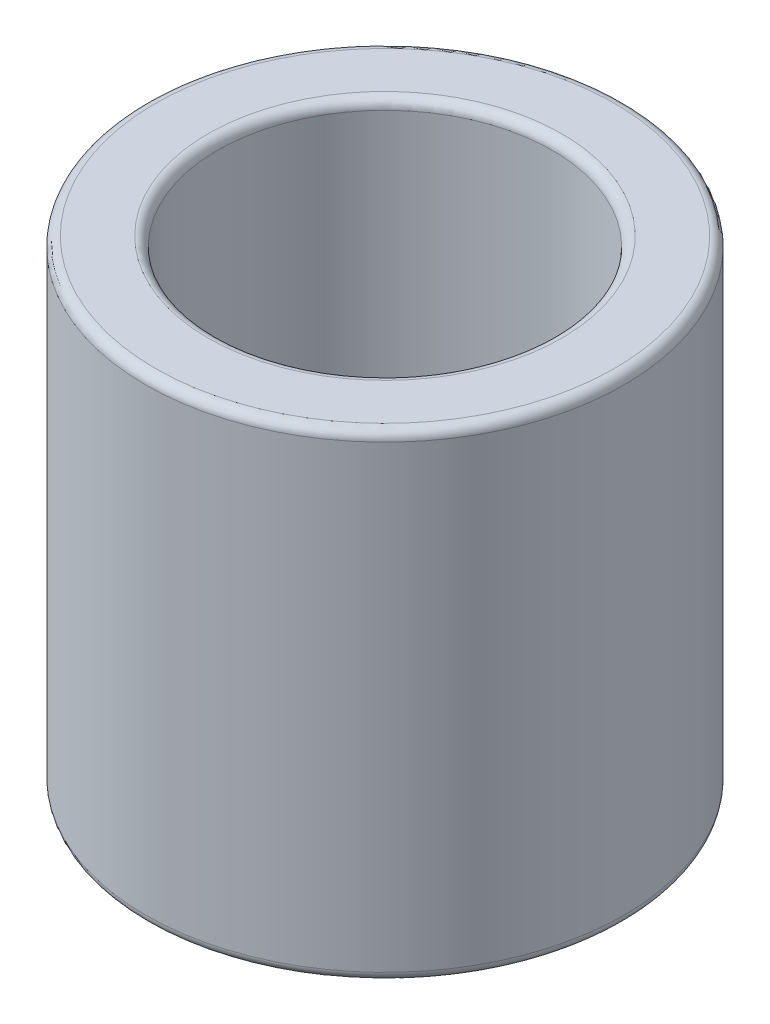
ISO-10303-21;
HEADER;
FILE_DESCRIPTION(('STEP AP214'),'2;1');
FILE_NAME('part.step','',(''),(''),'','','');
FILE_SCHEMA(('AUTOMOTIVE_DESIGN { 1 0 10303 214 1 1 1 1 }'));
ENDSEC;
DATA;
#1=APPLICATION_CONTEXT('core data for automotive mechanical design processes');
#2=APPLICATION_PROTOCOL_DEFINITION('international standard','automotive_design',2000,#1);
#3=PRODUCT_CONTEXT('',#1,'mechanical');
#4=PRODUCT('Part','Part','',(#3));
#5=PRODUCT_RELATED_PRODUCT_CATEGORY('part','',(#4));
#6=PRODUCT_DEFINITION_FORMATION('','',#4);
#7=PRODUCT_DEFINITION_CONTEXT('part definition',#1,'design');
#8=PRODUCT_DEFINITION('design','',#6,#7);
#9=PRODUCT_DEFINITION_SHAPE('','',#8);
#10=(LENGTH_UNIT() NAMED_UNIT(*) SI_UNIT(.MILLI.,.METRE.));
#11=(NAMED_UNIT(*) PLANE_ANGLE_UNIT() SI_UNIT($,.RADIAN.));
#12=(NAMED_UNIT(*) SI_UNIT($,.STERADIAN.) SOLID_ANGLE_UNIT());
#13=UNCERTAINTY_MEASURE_WITH_UNIT(LENGTH_MEASURE(1.E-05),#10,'distance_accuracy_value','');
#14=(GEOMETRIC_REPRESENTATION_CONTEXT(3) GLOBAL_UNCERTAINTY_ASSIGNED_CONTEXT((#13)) GLOBAL_UNIT_ASSIGNED_CONTEXT((#10,
#11,#12)) REPRESENTATION_CONTEXT('',''));
#15=CARTESIAN_POINT('',(0.,0.,0.));
#16=DIRECTION('',(0.,0.,1.));
#17=DIRECTION('',(1.,0.,0.));
#18=AXIS2_PLACEMENT_3D('',#15,#16,#17);
#19=CARTESIAN_POINT('',(0.,5.,0.));
#20=DIRECTION('',(0.,1.,0.));
#21=DIRECTION('',(0.,0.,1.));
#22=AXIS2_PLACEMENT_3D('',#19,#20,#21);
#23=PLANE('',#22);
#24=CARTESIAN_POINT('',(0.,5.,0.));
#25=DIRECTION('',(0.,1.,0.));
#26=DIRECTION('',(0.,0.,1.));
#27=AXIS2_PLACEMENT_3D('',#24,#25,#26);
#28=CIRCLE('',#27,1.85);
#29=CARTESIAN_POINT('',(0.,5.,1.85));
#30=VERTEX_POINT('',#29);
#31=EDGE_CURVE('E10',#30,#30,#28,.F.);
#32=ORIENTED_EDGE('',*,*,#31,.T.);
#33=EDGE_LOOP('',(#32));
#34=FACE_BOUND('',#33,.T.);
#35=CARTESIAN_POINT('',(0.,5.,0.));
#36=DIRECTION('',(0.,1.,0.));
#37=DIRECTION('',(0.,0.,1.));
#38=AXIS2_PLACEMENT_3D('',#35,#36,#37);
#39=CIRCLE('',#38,2.4);
#40=CARTESIAN_POINT('',(0.,5.,2.4));
#41=VERTEX_POINT('',#40);
#42=EDGE_CURVE('E42',#41,#41,#39,.T.);
#43=ORIENTED_EDGE('',*,*,#42,.T.);
#44=EDGE_LOOP('',(#43));
#45=FACE_BOUND('',#44,.T.);
#46=ADVANCED_FACE('F40',(#34,#45),#23,.T.);
#47=CARTESIAN_POINT('',(0.,0.,0.));
#48=DIRECTION('',(0.,1.,0.));
#49=DIRECTION('',(0.,0.,1.));
#50=AXIS2_PLACEMENT_3D('',#47,#48,#49);
#51=PLANE('',#50);
#52=CARTESIAN_POINT('',(0.,0.,0.));
#53=DIRECTION('',(0.,1.,0.));
#54=DIRECTION('',(0.,0.,1.));
#55=AXIS2_PLACEMENT_3D('',#52,#53,#54);
#56=CIRCLE('',#55,1.85);
#57=CARTESIAN_POINT('',(0.,0.,1.85));
#58=VERTEX_POINT('',#57);
#59=EDGE_CURVE('E65',#58,#58,#56,.T.);
#60=ORIENTED_EDGE('',*,*,#59,.T.);
#61=EDGE_LOOP('',(#60));
#62=FACE_BOUND('',#61,.T.);
#63=CARTESIAN_POINT('',(0.,0.,0.));
#64=DIRECTION('',(0.,1.,0.));
#65=DIRECTION('',(0.,0.,1.));
#66=AXIS2_PLACEMENT_3D('',#63,#64,#65);
#67=CIRCLE('',#66,2.4);
#68=CARTESIAN_POINT('',(0.,0.,2.4));
#69=VERTEX_POINT('',#68);
#70=EDGE_CURVE('E66',#69,#69,#67,.F.);
#71=ORIENTED_EDGE('',*,*,#70,.T.);
#72=EDGE_LOOP('',(#71));
#73=FACE_BOUND('',#72,.T.);
#74=ADVANCED_FACE('F70',(#62,#73),#51,.F.);
#75=CARTESIAN_POINT('',(0.,5.,0.));
#76=DIRECTION('',(0.,-1.,0.));
#77=DIRECTION('',(0.,0.,-1.));
#78=AXIS2_PLACEMENT_3D('',#75,#76,#77);
#79=CYLINDRICAL_SURFACE('',#78,2.5);
#80=CARTESIAN_POINT('',(0.,0.1,0.));
#81=DIRECTION('',(0.,1.,0.));
#82=DIRECTION('',(0.,0.,1.));
#83=AXIS2_PLACEMENT_3D('',#80,#81,#82);
#84=CIRCLE('',#83,2.5);
#85=CARTESIAN_POINT('',(0.,0.1,2.5));
#86=VERTEX_POINT('',#85);
#87=EDGE_CURVE('E48',#86,#86,#84,.T.);
#88=ORIENTED_EDGE('',*,*,#87,.T.);
#89=EDGE_LOOP('',(#88));
#90=FACE_BOUND('',#89,.T.);
#91=CARTESIAN_POINT('',(0.,4.9,0.));
#92=DIRECTION('',(0.,1.,0.));
#93=DIRECTION('',(0.,0.,1.));
#94=AXIS2_PLACEMENT_3D('',#91,#92,#93);
#95=CIRCLE('',#94,2.5);
#96=CARTESIAN_POINT('',(0.,4.9,2.5));
#97=VERTEX_POINT('',#96);
#98=EDGE_CURVE('E55',#97,#97,#95,.F.);
#99=ORIENTED_EDGE('',*,*,#98,.T.);
#100=EDGE_LOOP('',(#99));
#101=FACE_BOUND('',#100,.T.);
#102=ADVANCED_FACE('F77',(#90,#101),#79,.T.);
#103=CARTESIAN_POINT('',(0.,5.,0.));
#104=DIRECTION('',(0.,-1.,0.));
#105=DIRECTION('',(0.,0.,-1.));
#106=AXIS2_PLACEMENT_3D('',#103,#104,#105);
#107=CYLINDRICAL_SURFACE('',#106,1.75);
#108=CARTESIAN_POINT('',(0.,0.1,0.));
#109=DIRECTION('',(0.,1.,0.));
#110=DIRECTION('',(0.,0.,1.));
#111=AXIS2_PLACEMENT_3D('',#108,#109,#110);
#112=CIRCLE('',#111,1.75);
#113=CARTESIAN_POINT('',(0.,0.1,1.75));
#114=VERTEX_POINT('',#113);
#115=EDGE_CURVE('E60',#114,#114,#112,.F.);
#116=ORIENTED_EDGE('',*,*,#115,.T.);
#117=EDGE_LOOP('',(#116));
#118=FACE_BOUND('',#117,.T.);
#119=CARTESIAN_POINT('',(0.,4.9,0.));
#120=DIRECTION('',(0.,1.,0.));
#121=DIRECTION('',(0.,0.,1.));
#122=AXIS2_PLACEMENT_3D('',#119,#120,#121);
#123=CIRCLE('',#122,1.75);
#124=CARTESIAN_POINT('',(0.,4.9,1.75));
#125=VERTEX_POINT('',#124);
#126=EDGE_CURVE('E58',#125,#125,#123,.T.);
#127=ORIENTED_EDGE('',*,*,#126,.T.);
#128=EDGE_LOOP('',(#127));
#129=FACE_BOUND('',#128,.T.);
#130=ADVANCED_FACE('F84',(#118,#129),#107,.F.);
#131=CARTESIAN_POINT('',(0.,0.1,0.));
#132=DIRECTION('',(0.,1.,0.));
#133=DIRECTION('',(0.,0.,1.));
#134=AXIS2_PLACEMENT_3D('',#131,#132,#133);
#135=TOROIDAL_SURFACE('',#134,1.85,0.1);
#136=ORIENTED_EDGE('',*,*,#115,.F.);
#137=EDGE_LOOP('',(#136));
#138=FACE_BOUND('',#137,.T.);
#139=ORIENTED_EDGE('',*,*,#59,.F.);
#140=EDGE_LOOP('',(#139));
#141=FACE_BOUND('',#140,.T.);
#142=ADVANCED_FACE('F79',(#138,#141),#135,.T.);
#143=CARTESIAN_POINT('',(0.,0.1,0.));
#144=DIRECTION('',(0.,1.,0.));
#145=DIRECTION('',(0.,0.,1.));
#146=AXIS2_PLACEMENT_3D('',#143,#144,#145);
#147=TOROIDAL_SURFACE('',#146,2.4,0.1);
#148=ORIENTED_EDGE('',*,*,#70,.F.);
#149=EDGE_LOOP('',(#148));
#150=FACE_BOUND('',#149,.T.);
#151=ORIENTED_EDGE('',*,*,#87,.F.);
#152=EDGE_LOOP('',(#151));
#153=FACE_BOUND('',#152,.T.);
#154=ADVANCED_FACE('F75',(#150,#153),#147,.T.);
#155=CARTESIAN_POINT('',(0.,4.9,0.));
#156=DIRECTION('',(0.,1.,0.));
#157=DIRECTION('',(0.,0.,1.));
#158=AXIS2_PLACEMENT_3D('',#155,#156,#157);
#159=TOROIDAL_SURFACE('',#158,1.85,0.1);
#160=ORIENTED_EDGE('',*,*,#31,.F.);
#161=EDGE_LOOP('',(#160));
#162=FACE_BOUND('',#161,.T.);
#163=ORIENTED_EDGE('',*,*,#126,.F.);
#164=EDGE_LOOP('',(#163));
#165=FACE_BOUND('',#164,.T.);
#166=ADVANCED_FACE('F73',(#162,#165),#159,.T.);
#167=CARTESIAN_POINT('',(0.,4.9,0.));
#168=DIRECTION('',(0.,1.,0.));
#169=DIRECTION('',(0.,0.,1.));
#170=AXIS2_PLACEMENT_3D('',#167,#168,#169);
#171=TOROIDAL_SURFACE('',#170,2.4,0.1);
#172=ORIENTED_EDGE('',*,*,#98,.F.);
#173=EDGE_LOOP('',(#172));
#174=FACE_BOUND('',#173,.T.);
#175=ORIENTED_EDGE('',*,*,#42,.F.);
#176=EDGE_LOOP('',(#175));
#177=FACE_BOUND('',#176,.T.);
#178=ADVANCED_FACE('F39',(#174,#177),#171,.T.);
#179=CLOSED_SHELL('',(#46,#74,#102,#130,#142,#154,#166,#178));
#180=MANIFOLD_SOLID_BREP('B2',#179);
#181=ADVANCED_BREP_SHAPE_REPRESENTATION('',(#18,#180),#14);
#182=SHAPE_DEFINITION_REPRESENTATION(#9,#181);
ENDSEC;
END-ISO-10303-21;
